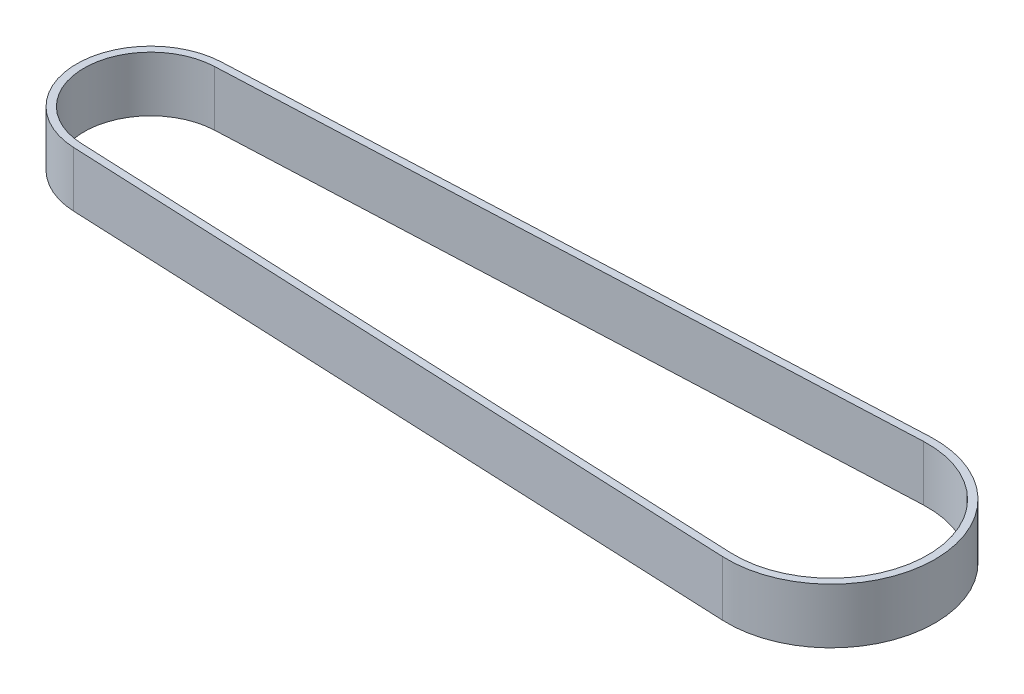
ISO-10303-21;
HEADER;
FILE_DESCRIPTION(('STEP AP214'),'2;1');
FILE_NAME('part.step','',(''),(''),'','','');
FILE_SCHEMA(('AUTOMOTIVE_DESIGN { 1 0 10303 214 1 1 1 1 }'));
ENDSEC;
DATA;
#1=APPLICATION_CONTEXT('core data for automotive mechanical design processes');
#2=APPLICATION_PROTOCOL_DEFINITION('international standard','automotive_design',2000,#1);
#3=PRODUCT_CONTEXT('',#1,'mechanical');
#4=PRODUCT('Part','Part','',(#3));
#5=PRODUCT_RELATED_PRODUCT_CATEGORY('part','',(#4));
#6=PRODUCT_DEFINITION_FORMATION('','',#4);
#7=PRODUCT_DEFINITION_CONTEXT('part definition',#1,'design');
#8=PRODUCT_DEFINITION('design','',#6,#7);
#9=PRODUCT_DEFINITION_SHAPE('','',#8);
#10=(LENGTH_UNIT() NAMED_UNIT(*) SI_UNIT(.MILLI.,.METRE.));
#11=(NAMED_UNIT(*) PLANE_ANGLE_UNIT() SI_UNIT($,.RADIAN.));
#12=(NAMED_UNIT(*) SI_UNIT($,.STERADIAN.) SOLID_ANGLE_UNIT());
#13=UNCERTAINTY_MEASURE_WITH_UNIT(LENGTH_MEASURE(1.E-05),#10,'distance_accuracy_value','');
#14=(GEOMETRIC_REPRESENTATION_CONTEXT(3) GLOBAL_UNCERTAINTY_ASSIGNED_CONTEXT((#13)) GLOBAL_UNIT_ASSIGNED_CONTEXT((#10,
#11,#12)) REPRESENTATION_CONTEXT('',''));
#15=CARTESIAN_POINT('',(0.,0.,0.));
#16=DIRECTION('',(0.,0.,1.));
#17=DIRECTION('',(1.,0.,0.));
#18=AXIS2_PLACEMENT_3D('',#15,#16,#17);
#19=CARTESIAN_POINT('',(-74.,6.,0.));
#20=DIRECTION('',(0.,1.,0.));
#21=DIRECTION('',(0.,0.,1.));
#22=AXIS2_PLACEMENT_3D('',#19,#20,#21);
#23=PLANE('',#22);
#24=CARTESIAN_POINT('',(-74.,6.,0.));
#25=DIRECTION('',(0.,1.,0.));
#26=DIRECTION('',(0.,0.,1.));
#27=AXIS2_PLACEMENT_3D('',#24,#25,#26);
#28=CIRCLE('',#27,8.05);
#29=CARTESIAN_POINT('',(-74.3535472972973,6.,-8.04223254504455));
#30=VERTEX_POINT('',#29);
#31=CARTESIAN_POINT('',(-74.3535472972973,6.,8.04223254504455));
#32=VERTEX_POINT('',#31);
#33=EDGE_CURVE('E133',#30,#32,#28,.T.);
#34=ORIENTED_EDGE('',*,*,#33,.T.);
#35=DIRECTION('',(0.999035098763298,0.,0.0439189189189189));
#36=VECTOR('',#35,1.);
#37=CARTESIAN_POINT('',(-74.3535472972973,6.,8.04223254504455));
#38=LINE('',#37,#36);
#39=CARTESIAN_POINT('',(-0.496283783783785,6.,11.2890966160253));
#40=VERTEX_POINT('',#39);
#41=EDGE_CURVE('E136',#32,#40,#38,.T.);
#42=ORIENTED_EDGE('',*,*,#41,.T.);
#43=CARTESIAN_POINT('',(0.,6.,0.));
#44=DIRECTION('',(0.,1.,0.));
#45=DIRECTION('',(0.,0.,1.));
#46=AXIS2_PLACEMENT_3D('',#43,#44,#45);
#47=CIRCLE('',#46,11.3);
#48=CARTESIAN_POINT('',(-0.496283783783778,6.,-11.2890966160253));
#49=VERTEX_POINT('',#48);
#50=EDGE_CURVE('E139',#40,#49,#47,.T.);
#51=ORIENTED_EDGE('',*,*,#50,.T.);
#52=DIRECTION('',(-0.999035098763298,0.,0.0439189189189189));
#53=VECTOR('',#52,1.);
#54=CARTESIAN_POINT('',(-74.3535472972973,6.,-8.04223254504455));
#55=LINE('',#54,#53);
#56=EDGE_CURVE('E141',#49,#30,#55,.T.);
#57=ORIENTED_EDGE('',*,*,#56,.T.);
#58=EDGE_LOOP('',(#34,#42,#51,#57));
#59=FACE_BOUND('',#58,.T.);
#60=DIRECTION('',(0.999035098763298,0.,0.0439189189189189));
#61=VECTOR('',#60,1.);
#62=CARTESIAN_POINT('',(-74.3184121621622,6.,7.24300446603391));
#63=LINE('',#62,#61);
#64=CARTESIAN_POINT('',(-74.3184121621622,6.,7.24300446603391));
#65=VERTEX_POINT('',#64);
#66=CARTESIAN_POINT('',(-0.461148648648649,6.,10.4898685370146));
#67=VERTEX_POINT('',#66);
#68=EDGE_CURVE('E105',#65,#67,#63,.T.);
#69=ORIENTED_EDGE('',*,*,#68,.F.);
#70=CARTESIAN_POINT('',(-74.,6.,0.));
#71=DIRECTION('',(0.,1.,0.));
#72=DIRECTION('',(0.,0.,1.));
#73=AXIS2_PLACEMENT_3D('',#70,#71,#72);
#74=CIRCLE('',#73,7.25);
#75=CARTESIAN_POINT('',(-74.3184121621622,6.,-7.24300446603391));
#76=VERTEX_POINT('',#75);
#77=EDGE_CURVE('E97',#76,#65,#74,.T.);
#78=ORIENTED_EDGE('',*,*,#77,.F.);
#79=DIRECTION('',(-0.999035098763298,0.,0.0439189189189189));
#80=VECTOR('',#79,1.);
#81=CARTESIAN_POINT('',(-74.3184121621622,6.,-7.24300446603391));
#82=LINE('',#81,#80);
#83=CARTESIAN_POINT('',(-0.461148648648657,6.,-10.4898685370146));
#84=VERTEX_POINT('',#83);
#85=EDGE_CURVE('E119',#84,#76,#82,.T.);
#86=ORIENTED_EDGE('',*,*,#85,.F.);
#87=CARTESIAN_POINT('',(0.,6.,0.));
#88=DIRECTION('',(0.,1.,0.));
#89=DIRECTION('',(0.,0.,1.));
#90=AXIS2_PLACEMENT_3D('',#87,#88,#89);
#91=CIRCLE('',#90,10.5);
#92=EDGE_CURVE('E117',#67,#84,#91,.T.);
#93=ORIENTED_EDGE('',*,*,#92,.F.);
#94=EDGE_LOOP('',(#69,#78,#86,#93));
#95=FACE_BOUND('',#94,.T.);
#96=ADVANCED_FACE('F32',(#59,#95),#23,.T.);
#97=CARTESIAN_POINT('',(-74.,0.,0.));
#98=DIRECTION('',(0.,1.,0.));
#99=DIRECTION('',(0.,0.,1.));
#100=AXIS2_PLACEMENT_3D('',#97,#98,#99);
#101=PLANE('',#100);
#102=CARTESIAN_POINT('',(-74.,0.,0.));
#103=DIRECTION('',(0.,1.,0.));
#104=DIRECTION('',(0.,0.,1.));
#105=AXIS2_PLACEMENT_3D('',#102,#103,#104);
#106=CIRCLE('',#105,8.05);
#107=CARTESIAN_POINT('',(-74.3535472972973,0.,-8.04223254504455));
#108=VERTEX_POINT('',#107);
#109=CARTESIAN_POINT('',(-74.3535472972973,0.,8.04223254504455));
#110=VERTEX_POINT('',#109);
#111=EDGE_CURVE('E113',#108,#110,#106,.T.);
#112=ORIENTED_EDGE('',*,*,#111,.F.);
#113=DIRECTION('',(-0.999035098763298,0.,0.0439189189189189));
#114=VECTOR('',#113,1.);
#115=CARTESIAN_POINT('',(-74.3535472972973,0.,-8.04223254504455));
#116=LINE('',#115,#114);
#117=CARTESIAN_POINT('',(-0.496283783783778,0.,-11.2890966160253));
#118=VERTEX_POINT('',#117);
#119=EDGE_CURVE('E137',#118,#108,#116,.T.);
#120=ORIENTED_EDGE('',*,*,#119,.F.);
#121=CARTESIAN_POINT('',(0.,0.,0.));
#122=DIRECTION('',(0.,1.,0.));
#123=DIRECTION('',(0.,0.,1.));
#124=AXIS2_PLACEMENT_3D('',#121,#122,#123);
#125=CIRCLE('',#124,11.3);
#126=CARTESIAN_POINT('',(-0.496283783783785,0.,11.2890966160253));
#127=VERTEX_POINT('',#126);
#128=EDGE_CURVE('E148',#127,#118,#125,.T.);
#129=ORIENTED_EDGE('',*,*,#128,.F.);
#130=DIRECTION('',(0.999035098763298,0.,0.0439189189189189));
#131=VECTOR('',#130,1.);
#132=CARTESIAN_POINT('',(-74.3535472972973,0.,8.04223254504455));
#133=LINE('',#132,#131);
#134=EDGE_CURVE('E146',#110,#127,#133,.T.);
#135=ORIENTED_EDGE('',*,*,#134,.F.);
#136=EDGE_LOOP('',(#112,#120,#129,#135));
#137=FACE_BOUND('',#136,.T.);
#138=CARTESIAN_POINT('',(-74.,0.,0.));
#139=DIRECTION('',(0.,1.,0.));
#140=DIRECTION('',(0.,0.,1.));
#141=AXIS2_PLACEMENT_3D('',#138,#139,#140);
#142=CIRCLE('',#141,7.25);
#143=CARTESIAN_POINT('',(-74.3184121621622,0.,-7.24300446603391));
#144=VERTEX_POINT('',#143);
#145=CARTESIAN_POINT('',(-74.3184121621622,0.,7.24300446603391));
#146=VERTEX_POINT('',#145);
#147=EDGE_CURVE('E55',#144,#146,#142,.T.);
#148=ORIENTED_EDGE('',*,*,#147,.T.);
#149=DIRECTION('',(0.999035098763298,0.,0.0439189189189189));
#150=VECTOR('',#149,1.);
#151=CARTESIAN_POINT('',(-74.3184121621622,0.,7.24300446603391));
#152=LINE('',#151,#150);
#153=CARTESIAN_POINT('',(-0.461148648648649,0.,10.4898685370146));
#154=VERTEX_POINT('',#153);
#155=EDGE_CURVE('E112',#146,#154,#152,.T.);
#156=ORIENTED_EDGE('',*,*,#155,.T.);
#157=CARTESIAN_POINT('',(0.,0.,0.));
#158=DIRECTION('',(0.,1.,0.));
#159=DIRECTION('',(0.,0.,1.));
#160=AXIS2_PLACEMENT_3D('',#157,#158,#159);
#161=CIRCLE('',#160,10.5);
#162=CARTESIAN_POINT('',(-0.461148648648656,0.,-10.4898685370146));
#163=VERTEX_POINT('',#162);
#164=EDGE_CURVE('E125',#154,#163,#161,.T.);
#165=ORIENTED_EDGE('',*,*,#164,.T.);
#166=DIRECTION('',(-0.999035098763298,0.,0.0439189189189189));
#167=VECTOR('',#166,1.);
#168=CARTESIAN_POINT('',(-74.3184121621622,0.,-7.24300446603391));
#169=LINE('',#168,#167);
#170=EDGE_CURVE('E106',#163,#144,#169,.T.);
#171=ORIENTED_EDGE('',*,*,#170,.T.);
#172=EDGE_LOOP('',(#148,#156,#165,#171));
#173=FACE_BOUND('',#172,.T.);
#174=ADVANCED_FACE('F166',(#137,#173),#101,.F.);
#175=CARTESIAN_POINT('',(-74.,6.,0.));
#176=DIRECTION('',(0.,-1.,0.));
#177=DIRECTION('',(0.,0.,-1.));
#178=AXIS2_PLACEMENT_3D('',#175,#176,#177);
#179=CYLINDRICAL_SURFACE('',#178,8.05);
#180=ORIENTED_EDGE('',*,*,#111,.T.);
#181=DIRECTION('',(0.,-1.,0.));
#182=VECTOR('',#181,1.);
#183=CARTESIAN_POINT('',(-74.3535472972973,6.,8.04223254504455));
#184=LINE('',#183,#182);
#185=EDGE_CURVE('E11',#32,#110,#184,.T.);
#186=ORIENTED_EDGE('',*,*,#185,.F.);
#187=ORIENTED_EDGE('',*,*,#33,.F.);
#188=DIRECTION('',(0.,-1.,0.));
#189=VECTOR('',#188,1.);
#190=CARTESIAN_POINT('',(-74.3535472972973,6.,-8.04223254504455));
#191=LINE('',#190,#189);
#192=EDGE_CURVE('E143',#30,#108,#191,.T.);
#193=ORIENTED_EDGE('',*,*,#192,.T.);
#194=EDGE_LOOP('',(#180,#186,#187,#193));
#195=FACE_BOUND('',#194,.T.);
#196=ADVANCED_FACE('F34',(#195),#179,.T.);
#197=CARTESIAN_POINT('',(-74.3535472972973,6.,8.04223254504455));
#198=DIRECTION('',(0.0439189189189189,0.,-0.999035098763298));
#199=DIRECTION('',(-0.999035098763298,0.,-0.0439189189189189));
#200=AXIS2_PLACEMENT_3D('',#197,#198,#199);
#201=PLANE('',#200);
#202=ORIENTED_EDGE('',*,*,#134,.T.);
#203=DIRECTION('',(0.,-1.,0.));
#204=VECTOR('',#203,1.);
#205=CARTESIAN_POINT('',(-0.496283783783785,6.,11.2890966160253));
#206=LINE('',#205,#204);
#207=EDGE_CURVE('E40',#40,#127,#206,.T.);
#208=ORIENTED_EDGE('',*,*,#207,.F.);
#209=ORIENTED_EDGE('',*,*,#41,.F.);
#210=ORIENTED_EDGE('',*,*,#185,.T.);
#211=EDGE_LOOP('',(#202,#208,#209,#210));
#212=FACE_BOUND('',#211,.T.);
#213=ADVANCED_FACE('F176',(#212),#201,.F.);
#214=CARTESIAN_POINT('',(0.,6.,0.));
#215=DIRECTION('',(0.,-1.,0.));
#216=DIRECTION('',(0.,0.,-1.));
#217=AXIS2_PLACEMENT_3D('',#214,#215,#216);
#218=CYLINDRICAL_SURFACE('',#217,11.3);
#219=ORIENTED_EDGE('',*,*,#128,.T.);
#220=DIRECTION('',(0.,-1.,0.));
#221=VECTOR('',#220,1.);
#222=CARTESIAN_POINT('',(-0.496283783783778,6.,-11.2890966160253));
#223=LINE('',#222,#221);
#224=EDGE_CURVE('E153',#49,#118,#223,.T.);
#225=ORIENTED_EDGE('',*,*,#224,.F.);
#226=ORIENTED_EDGE('',*,*,#50,.F.);
#227=ORIENTED_EDGE('',*,*,#207,.T.);
#228=EDGE_LOOP('',(#219,#225,#226,#227));
#229=FACE_BOUND('',#228,.T.);
#230=ADVANCED_FACE('F160',(#229),#218,.T.);
#231=CARTESIAN_POINT('',(-74.3535472972973,6.,-8.04223254504455));
#232=DIRECTION('',(0.0439189189189189,0.,0.999035098763298));
#233=DIRECTION('',(0.999035098763299,0.,-0.0439189189189189));
#234=AXIS2_PLACEMENT_3D('',#231,#232,#233);
#235=PLANE('',#234);
#236=ORIENTED_EDGE('',*,*,#119,.T.);
#237=ORIENTED_EDGE('',*,*,#192,.F.);
#238=ORIENTED_EDGE('',*,*,#56,.F.);
#239=ORIENTED_EDGE('',*,*,#224,.T.);
#240=EDGE_LOOP('',(#236,#237,#238,#239));
#241=FACE_BOUND('',#240,.T.);
#242=ADVANCED_FACE('F170',(#241),#235,.F.);
#243=CARTESIAN_POINT('',(-74.,6.,0.));
#244=DIRECTION('',(0.,-1.,0.));
#245=DIRECTION('',(0.,0.,-1.));
#246=AXIS2_PLACEMENT_3D('',#243,#244,#245);
#247=CYLINDRICAL_SURFACE('',#246,7.25);
#248=ORIENTED_EDGE('',*,*,#147,.F.);
#249=DIRECTION('',(0.,-1.,0.));
#250=VECTOR('',#249,1.);
#251=CARTESIAN_POINT('',(-74.3184121621622,6.,-7.24300446603391));
#252=LINE('',#251,#250);
#253=EDGE_CURVE('E101',#76,#144,#252,.T.);
#254=ORIENTED_EDGE('',*,*,#253,.F.);
#255=ORIENTED_EDGE('',*,*,#77,.T.);
#256=DIRECTION('',(0.,-1.,0.));
#257=VECTOR('',#256,1.);
#258=CARTESIAN_POINT('',(-74.3184121621622,6.,7.24300446603391));
#259=LINE('',#258,#257);
#260=EDGE_CURVE('E100',#65,#146,#259,.T.);
#261=ORIENTED_EDGE('',*,*,#260,.T.);
#262=EDGE_LOOP('',(#248,#254,#255,#261));
#263=FACE_BOUND('',#262,.T.);
#264=ADVANCED_FACE('F99',(#263),#247,.F.);
#265=CARTESIAN_POINT('',(-74.3184121621622,6.,7.24300446603391));
#266=DIRECTION('',(0.0439189189189189,0.,-0.999035098763298));
#267=DIRECTION('',(-0.999035098763299,0.,-0.0439189189189189));
#268=AXIS2_PLACEMENT_3D('',#265,#266,#267);
#269=PLANE('',#268);
#270=ORIENTED_EDGE('',*,*,#155,.F.);
#271=ORIENTED_EDGE('',*,*,#260,.F.);
#272=ORIENTED_EDGE('',*,*,#68,.T.);
#273=DIRECTION('',(0.,-1.,0.));
#274=VECTOR('',#273,1.);
#275=CARTESIAN_POINT('',(-0.461148648648649,6.,10.4898685370146));
#276=LINE('',#275,#274);
#277=EDGE_CURVE('E114',#67,#154,#276,.T.);
#278=ORIENTED_EDGE('',*,*,#277,.T.);
#279=EDGE_LOOP('',(#270,#271,#272,#278));
#280=FACE_BOUND('',#279,.T.);
#281=ADVANCED_FACE('F109',(#280),#269,.T.);
#282=CARTESIAN_POINT('',(0.,6.,0.));
#283=DIRECTION('',(0.,-1.,0.));
#284=DIRECTION('',(0.,0.,-1.));
#285=AXIS2_PLACEMENT_3D('',#282,#283,#284);
#286=CYLINDRICAL_SURFACE('',#285,10.5);
#287=ORIENTED_EDGE('',*,*,#164,.F.);
#288=ORIENTED_EDGE('',*,*,#277,.F.);
#289=ORIENTED_EDGE('',*,*,#92,.T.);
#290=DIRECTION('',(0.,-1.,0.));
#291=VECTOR('',#290,1.);
#292=CARTESIAN_POINT('',(-0.461148648648656,6.,-10.4898685370146));
#293=LINE('',#292,#291);
#294=EDGE_CURVE('E47',#84,#163,#293,.T.);
#295=ORIENTED_EDGE('',*,*,#294,.T.);
#296=EDGE_LOOP('',(#287,#288,#289,#295));
#297=FACE_BOUND('',#296,.T.);
#298=ADVANCED_FACE('F199',(#297),#286,.F.);
#299=CARTESIAN_POINT('',(-74.3184121621622,6.,-7.24300446603391));
#300=DIRECTION('',(0.0439189189189189,0.,0.999035098763298));
#301=DIRECTION('',(0.999035098763299,0.,-0.0439189189189189));
#302=AXIS2_PLACEMENT_3D('',#299,#300,#301);
#303=PLANE('',#302);
#304=ORIENTED_EDGE('',*,*,#170,.F.);
#305=ORIENTED_EDGE('',*,*,#294,.F.);
#306=ORIENTED_EDGE('',*,*,#85,.T.);
#307=ORIENTED_EDGE('',*,*,#253,.T.);
#308=EDGE_LOOP('',(#304,#305,#306,#307));
#309=FACE_BOUND('',#308,.T.);
#310=ADVANCED_FACE('F203',(#309),#303,.T.);
#311=CLOSED_SHELL('',(#96,#174,#196,#213,#230,#242,#264,#281,#298,#310));
#312=MANIFOLD_SOLID_BREP('B2',#311);
#313=ADVANCED_BREP_SHAPE_REPRESENTATION('',(#18,#312),#14);
#314=SHAPE_DEFINITION_REPRESENTATION(#9,#313);
ENDSEC;
END-ISO-10303-21;
